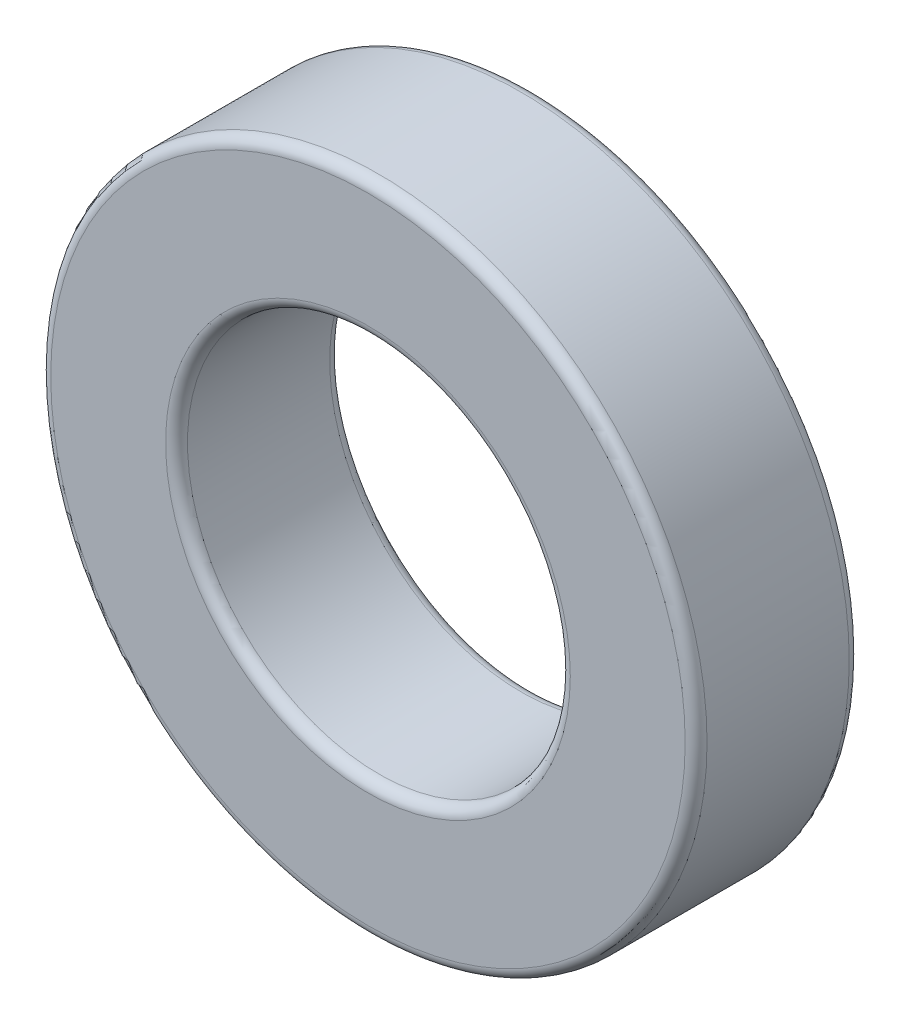
ISO-10303-21;
HEADER;
FILE_DESCRIPTION(('STEP AP214'),'2;1');
FILE_NAME('part.step','',(''),(''),'','','');
FILE_SCHEMA(('AUTOMOTIVE_DESIGN { 1 0 10303 214 1 1 1 1 }'));
ENDSEC;
DATA;
#1=APPLICATION_CONTEXT('core data for automotive mechanical design processes');
#2=APPLICATION_PROTOCOL_DEFINITION('international standard','automotive_design',2000,#1);
#3=PRODUCT_CONTEXT('',#1,'mechanical');
#4=PRODUCT('Part','Part','',(#3));
#5=PRODUCT_RELATED_PRODUCT_CATEGORY('part','',(#4));
#6=PRODUCT_DEFINITION_FORMATION('','',#4);
#7=PRODUCT_DEFINITION_CONTEXT('part definition',#1,'design');
#8=PRODUCT_DEFINITION('design','',#6,#7);
#9=PRODUCT_DEFINITION_SHAPE('','',#8);
#10=(LENGTH_UNIT() NAMED_UNIT(*) SI_UNIT(.MILLI.,.METRE.));
#11=(NAMED_UNIT(*) PLANE_ANGLE_UNIT() SI_UNIT($,.RADIAN.));
#12=(NAMED_UNIT(*) SI_UNIT($,.STERADIAN.) SOLID_ANGLE_UNIT());
#13=UNCERTAINTY_MEASURE_WITH_UNIT(LENGTH_MEASURE(1.E-05),#10,'distance_accuracy_value','');
#14=(GEOMETRIC_REPRESENTATION_CONTEXT(3) GLOBAL_UNCERTAINTY_ASSIGNED_CONTEXT((#13)) GLOBAL_UNIT_ASSIGNED_CONTEXT((#10,
#11,#12)) REPRESENTATION_CONTEXT('',''));
#15=CARTESIAN_POINT('',(0.,0.,0.));
#16=DIRECTION('',(0.,0.,1.));
#17=DIRECTION('',(1.,0.,0.));
#18=AXIS2_PLACEMENT_3D('',#15,#16,#17);
#19=CARTESIAN_POINT('',(0.,0.,0.75));
#20=DIRECTION('',(0.,0.,1.));
#21=DIRECTION('',(1.,0.,0.));
#22=AXIS2_PLACEMENT_3D('',#19,#20,#21);
#23=PLANE('',#22);
#24=CARTESIAN_POINT('',(0.,0.,0.75));
#25=DIRECTION('',(0.,0.,1.));
#26=DIRECTION('',(1.,0.,0.));
#27=AXIS2_PLACEMENT_3D('',#24,#25,#26);
#28=CIRCLE('',#27,0.925);
#29=CARTESIAN_POINT('',(0.925,0.,0.75));
#30=VERTEX_POINT('',#29);
#31=EDGE_CURVE('E10',#30,#30,#28,.F.);
#32=ORIENTED_EDGE('',*,*,#31,.T.);
#33=EDGE_LOOP('',(#32));
#34=FACE_BOUND('',#33,.T.);
#35=CARTESIAN_POINT('',(0.,0.,0.75));
#36=DIRECTION('',(0.,0.,1.));
#37=DIRECTION('',(1.,0.,0.));
#38=AXIS2_PLACEMENT_3D('',#35,#36,#37);
#39=CIRCLE('',#38,1.45);
#40=CARTESIAN_POINT('',(1.45,0.,0.75));
#41=VERTEX_POINT('',#40);
#42=EDGE_CURVE('E38',#41,#41,#39,.T.);
#43=ORIENTED_EDGE('',*,*,#42,.T.);
#44=EDGE_LOOP('',(#43));
#45=FACE_BOUND('',#44,.T.);
#46=ADVANCED_FACE('F31',(#34,#45),#23,.T.);
#47=CARTESIAN_POINT('',(0.,0.,0.));
#48=DIRECTION('',(0.,0.,1.));
#49=DIRECTION('',(1.,0.,0.));
#50=AXIS2_PLACEMENT_3D('',#47,#48,#49);
#51=PLANE('',#50);
#52=CARTESIAN_POINT('',(0.,0.,0.));
#53=DIRECTION('',(0.,0.,1.));
#54=DIRECTION('',(1.,0.,0.));
#55=AXIS2_PLACEMENT_3D('',#52,#53,#54);
#56=CIRCLE('',#55,0.925);
#57=CARTESIAN_POINT('',(0.925,0.,0.));
#58=VERTEX_POINT('',#57);
#59=EDGE_CURVE('E57',#58,#58,#56,.T.);
#60=ORIENTED_EDGE('',*,*,#59,.T.);
#61=EDGE_LOOP('',(#60));
#62=FACE_BOUND('',#61,.T.);
#63=CARTESIAN_POINT('',(0.,0.,0.));
#64=DIRECTION('',(0.,0.,1.));
#65=DIRECTION('',(1.,0.,0.));
#66=AXIS2_PLACEMENT_3D('',#63,#64,#65);
#67=CIRCLE('',#66,1.45);
#68=CARTESIAN_POINT('',(1.45,0.,0.));
#69=VERTEX_POINT('',#68);
#70=EDGE_CURVE('E60',#69,#69,#67,.F.);
#71=ORIENTED_EDGE('',*,*,#70,.T.);
#72=EDGE_LOOP('',(#71));
#73=FACE_BOUND('',#72,.T.);
#74=ADVANCED_FACE('F64',(#62,#73),#51,.F.);
#75=CARTESIAN_POINT('',(0.,0.,0.75));
#76=DIRECTION('',(0.,0.,-1.));
#77=DIRECTION('',(-1.,0.,0.));
#78=AXIS2_PLACEMENT_3D('',#75,#76,#77);
#79=CYLINDRICAL_SURFACE('',#78,1.5);
#80=CARTESIAN_POINT('',(0.,0.,0.05));
#81=DIRECTION('',(0.,0.,1.));
#82=DIRECTION('',(1.,0.,0.));
#83=AXIS2_PLACEMENT_3D('',#80,#81,#82);
#84=CIRCLE('',#83,1.5);
#85=CARTESIAN_POINT('',(1.5,0.,0.05));
#86=VERTEX_POINT('',#85);
#87=EDGE_CURVE('E42',#86,#86,#84,.T.);
#88=ORIENTED_EDGE('',*,*,#87,.T.);
#89=EDGE_LOOP('',(#88));
#90=FACE_BOUND('',#89,.T.);
#91=CARTESIAN_POINT('',(0.,0.,0.7));
#92=DIRECTION('',(0.,0.,1.));
#93=DIRECTION('',(1.,0.,0.));
#94=AXIS2_PLACEMENT_3D('',#91,#92,#93);
#95=CIRCLE('',#94,1.5);
#96=CARTESIAN_POINT('',(1.5,0.,0.7));
#97=VERTEX_POINT('',#96);
#98=EDGE_CURVE('E46',#97,#97,#95,.F.);
#99=ORIENTED_EDGE('',*,*,#98,.T.);
#100=EDGE_LOOP('',(#99));
#101=FACE_BOUND('',#100,.T.);
#102=ADVANCED_FACE('F74',(#90,#101),#79,.T.);
#103=CARTESIAN_POINT('',(0.,0.,0.75));
#104=DIRECTION('',(0.,0.,-1.));
#105=DIRECTION('',(-1.,0.,0.));
#106=AXIS2_PLACEMENT_3D('',#103,#104,#105);
#107=CYLINDRICAL_SURFACE('',#106,0.875);
#108=CARTESIAN_POINT('',(0.,0.,0.05));
#109=DIRECTION('',(0.,0.,1.));
#110=DIRECTION('',(1.,0.,0.));
#111=AXIS2_PLACEMENT_3D('',#108,#109,#110);
#112=CIRCLE('',#111,0.875);
#113=CARTESIAN_POINT('',(0.875,0.,0.05));
#114=VERTEX_POINT('',#113);
#115=EDGE_CURVE('E51',#114,#114,#112,.F.);
#116=ORIENTED_EDGE('',*,*,#115,.T.);
#117=EDGE_LOOP('',(#116));
#118=FACE_BOUND('',#117,.T.);
#119=CARTESIAN_POINT('',(0.,0.,0.7));
#120=DIRECTION('',(0.,0.,1.));
#121=DIRECTION('',(1.,0.,0.));
#122=AXIS2_PLACEMENT_3D('',#119,#120,#121);
#123=CIRCLE('',#122,0.875);
#124=CARTESIAN_POINT('',(0.875,0.,0.7));
#125=VERTEX_POINT('',#124);
#126=EDGE_CURVE('E54',#125,#125,#123,.T.);
#127=ORIENTED_EDGE('',*,*,#126,.T.);
#128=EDGE_LOOP('',(#127));
#129=FACE_BOUND('',#128,.T.);
#130=ADVANCED_FACE('F77',(#118,#129),#107,.F.);
#131=CARTESIAN_POINT('',(0.,0.,0.05));
#132=DIRECTION('',(0.,0.,1.));
#133=DIRECTION('',(1.,0.,0.));
#134=AXIS2_PLACEMENT_3D('',#131,#132,#133);
#135=TOROIDAL_SURFACE('',#134,0.925,0.05);
#136=ORIENTED_EDGE('',*,*,#115,.F.);
#137=EDGE_LOOP('',(#136));
#138=FACE_BOUND('',#137,.T.);
#139=ORIENTED_EDGE('',*,*,#59,.F.);
#140=EDGE_LOOP('',(#139));
#141=FACE_BOUND('',#140,.T.);
#142=ADVANCED_FACE('F70',(#138,#141),#135,.T.);
#143=CARTESIAN_POINT('',(0.,0.,0.05));
#144=DIRECTION('',(0.,0.,1.));
#145=DIRECTION('',(1.,0.,0.));
#146=AXIS2_PLACEMENT_3D('',#143,#144,#145);
#147=TOROIDAL_SURFACE('',#146,1.45,0.05);
#148=ORIENTED_EDGE('',*,*,#70,.F.);
#149=EDGE_LOOP('',(#148));
#150=FACE_BOUND('',#149,.T.);
#151=ORIENTED_EDGE('',*,*,#87,.F.);
#152=EDGE_LOOP('',(#151));
#153=FACE_BOUND('',#152,.T.);
#154=ADVANCED_FACE('F66',(#150,#153),#147,.T.);
#155=CARTESIAN_POINT('',(0.,0.,0.7));
#156=DIRECTION('',(0.,0.,1.));
#157=DIRECTION('',(1.,0.,0.));
#158=AXIS2_PLACEMENT_3D('',#155,#156,#157);
#159=TOROIDAL_SURFACE('',#158,0.925,0.05);
#160=ORIENTED_EDGE('',*,*,#31,.F.);
#161=EDGE_LOOP('',(#160));
#162=FACE_BOUND('',#161,.T.);
#163=ORIENTED_EDGE('',*,*,#126,.F.);
#164=EDGE_LOOP('',(#163));
#165=FACE_BOUND('',#164,.T.);
#166=ADVANCED_FACE('F69',(#162,#165),#159,.T.);
#167=CARTESIAN_POINT('',(0.,0.,0.7));
#168=DIRECTION('',(0.,0.,1.));
#169=DIRECTION('',(1.,0.,0.));
#170=AXIS2_PLACEMENT_3D('',#167,#168,#169);
#171=TOROIDAL_SURFACE('',#170,1.45,0.05);
#172=ORIENTED_EDGE('',*,*,#98,.F.);
#173=EDGE_LOOP('',(#172));
#174=FACE_BOUND('',#173,.T.);
#175=ORIENTED_EDGE('',*,*,#42,.F.);
#176=EDGE_LOOP('',(#175));
#177=FACE_BOUND('',#176,.T.);
#178=ADVANCED_FACE('F33',(#174,#177),#171,.T.);
#179=CLOSED_SHELL('',(#46,#74,#102,#130,#142,#154,#166,#178));
#180=MANIFOLD_SOLID_BREP('B2',#179);
#181=ADVANCED_BREP_SHAPE_REPRESENTATION('',(#18,#180),#14);
#182=SHAPE_DEFINITION_REPRESENTATION(#9,#181);
ENDSEC;
END-ISO-10303-21;
